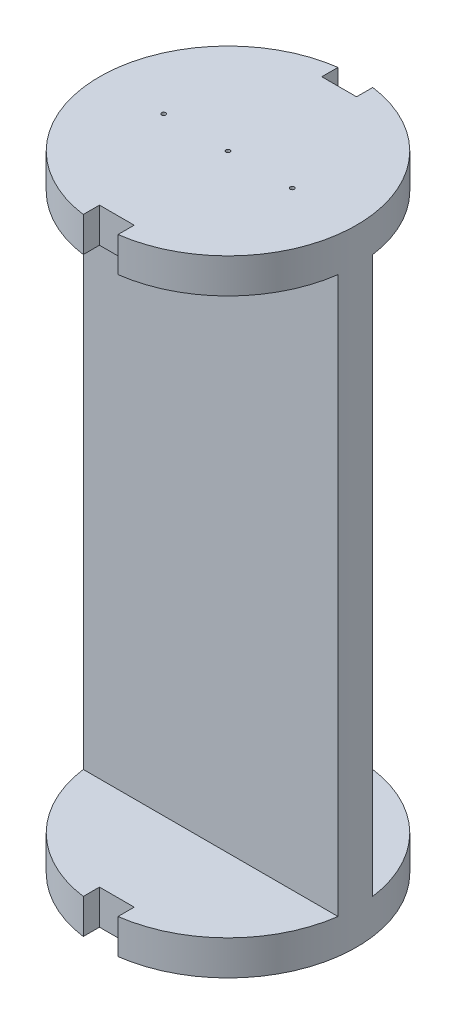
ISO-10303-21;
HEADER;
FILE_DESCRIPTION(('STEP AP214'),'2;1');
FILE_NAME('part.step','',(''),(''),'','','');
FILE_SCHEMA(('AUTOMOTIVE_DESIGN { 1 0 10303 214 1 1 1 1 }'));
ENDSEC;
DATA;
#1=APPLICATION_CONTEXT('core data for automotive mechanical design processes');
#2=APPLICATION_PROTOCOL_DEFINITION('international standard','automotive_design',2000,#1);
#3=PRODUCT_CONTEXT('',#1,'mechanical');
#4=PRODUCT('Part','Part','',(#3));
#5=PRODUCT_RELATED_PRODUCT_CATEGORY('part','',(#4));
#6=PRODUCT_DEFINITION_FORMATION('','',#4);
#7=PRODUCT_DEFINITION_CONTEXT('part definition',#1,'design');
#8=PRODUCT_DEFINITION('design','',#6,#7);
#9=PRODUCT_DEFINITION_SHAPE('','',#8);
#10=(LENGTH_UNIT() NAMED_UNIT(*) SI_UNIT(.MILLI.,.METRE.));
#11=(NAMED_UNIT(*) PLANE_ANGLE_UNIT() SI_UNIT($,.RADIAN.));
#12=(NAMED_UNIT(*) SI_UNIT($,.STERADIAN.) SOLID_ANGLE_UNIT());
#13=UNCERTAINTY_MEASURE_WITH_UNIT(LENGTH_MEASURE(1.E-05),#10,'distance_accuracy_value','');
#14=(GEOMETRIC_REPRESENTATION_CONTEXT(3) GLOBAL_UNCERTAINTY_ASSIGNED_CONTEXT((#13)) GLOBAL_UNIT_ASSIGNED_CONTEXT((#10,
#11,#12)) REPRESENTATION_CONTEXT('',''));
#15=CARTESIAN_POINT('',(0.,0.,0.));
#16=DIRECTION('',(0.,0.,1.));
#17=DIRECTION('',(1.,0.,0.));
#18=AXIS2_PLACEMENT_3D('',#15,#16,#17);
#19=CARTESIAN_POINT('',(0.,10.,0.));
#20=DIRECTION('',(0.,-1.,0.));
#21=DIRECTION('',(0.,0.,-1.));
#22=AXIS2_PLACEMENT_3D('',#19,#20,#21);
#23=CYLINDRICAL_SURFACE('',#22,37.);
#24=CARTESIAN_POINT('',(0.,180.,0.));
#25=DIRECTION('',(0.,1.,0.));
#26=DIRECTION('',(0.,0.,1.));
#27=AXIS2_PLACEMENT_3D('',#24,#25,#26);
#28=CIRCLE('',#27,37.);
#29=CARTESIAN_POINT('',(-5.,180.,-36.6606055596467));
#30=VERTEX_POINT('',#29);
#31=CARTESIAN_POINT('',(-5.,180.,36.6606055596467));
#32=VERTEX_POINT('',#31);
#33=EDGE_CURVE('E316',#30,#32,#28,.T.);
#34=ORIENTED_EDGE('',*,*,#33,.F.);
#35=DIRECTION('',(0.,-1.,0.));
#36=VECTOR('',#35,1.);
#37=CARTESIAN_POINT('',(-5.,10.,-36.6606055596467));
#38=LINE('',#37,#36);
#39=CARTESIAN_POINT('',(-5.,170.,-36.6606055596467));
#40=VERTEX_POINT('',#39);
#41=EDGE_CURVE('E309',#30,#40,#38,.T.);
#42=ORIENTED_EDGE('',*,*,#41,.T.);
#43=CARTESIAN_POINT('',(0.,170.,0.));
#44=DIRECTION('',(0.,1.,0.));
#45=DIRECTION('',(0.,0.,1.));
#46=AXIS2_PLACEMENT_3D('',#43,#44,#45);
#47=CIRCLE('',#46,37.);
#48=CARTESIAN_POINT('',(-36.6606055596467,170.,-5.));
#49=VERTEX_POINT('',#48);
#50=EDGE_CURVE('E321',#40,#49,#47,.T.);
#51=ORIENTED_EDGE('',*,*,#50,.T.);
#52=DIRECTION('',(0.,-1.,0.));
#53=VECTOR('',#52,1.);
#54=CARTESIAN_POINT('',(-36.6606055596467,180.002,-5.));
#55=LINE('',#54,#53);
#56=CARTESIAN_POINT('',(-36.6606055596467,10.,-5.));
#57=VERTEX_POINT('',#56);
#58=EDGE_CURVE('E336',#49,#57,#55,.T.);
#59=ORIENTED_EDGE('',*,*,#58,.T.);
#60=CARTESIAN_POINT('',(0.,10.,0.));
#61=DIRECTION('',(0.,1.,0.));
#62=DIRECTION('',(0.,0.,1.));
#63=AXIS2_PLACEMENT_3D('',#60,#61,#62);
#64=CIRCLE('',#63,37.);
#65=CARTESIAN_POINT('',(-5.,10.,-36.6606055596467));
#66=VERTEX_POINT('',#65);
#67=EDGE_CURVE('E364',#66,#57,#64,.T.);
#68=ORIENTED_EDGE('',*,*,#67,.F.);
#69=CARTESIAN_POINT('',(-5.,0.,-36.6606055596467));
#70=VERTEX_POINT('',#69);
#71=EDGE_CURVE('E313',#66,#70,#38,.T.);
#72=ORIENTED_EDGE('',*,*,#71,.T.);
#73=CARTESIAN_POINT('',(0.,0.,0.));
#74=DIRECTION('',(0.,1.,0.));
#75=DIRECTION('',(0.,0.,1.));
#76=AXIS2_PLACEMENT_3D('',#73,#74,#75);
#77=CIRCLE('',#76,37.);
#78=CARTESIAN_POINT('',(-5.,0.,36.6606055596467));
#79=VERTEX_POINT('',#78);
#80=EDGE_CURVE('E211',#70,#79,#77,.T.);
#81=ORIENTED_EDGE('',*,*,#80,.T.);
#82=DIRECTION('',(0.,-1.,0.));
#83=VECTOR('',#82,1.);
#84=CARTESIAN_POINT('',(-5.,10.,36.6606055596467));
#85=LINE('',#84,#83);
#86=CARTESIAN_POINT('',(-5.,10.,36.6606055596467));
#87=VERTEX_POINT('',#86);
#88=EDGE_CURVE('E271',#79,#87,#85,.F.);
#89=ORIENTED_EDGE('',*,*,#88,.T.);
#90=CARTESIAN_POINT('',(-36.6606055596467,10.,5.));
#91=VERTEX_POINT('',#90);
#92=EDGE_CURVE('E360',#91,#87,#64,.T.);
#93=ORIENTED_EDGE('',*,*,#92,.F.);
#94=DIRECTION('',(0.,-1.,0.));
#95=VECTOR('',#94,1.);
#96=CARTESIAN_POINT('',(-36.6606055596467,180.002,5.));
#97=LINE('',#96,#95);
#98=CARTESIAN_POINT('',(-36.6606055596467,170.,5.));
#99=VERTEX_POINT('',#98);
#100=EDGE_CURVE('E337',#99,#91,#97,.T.);
#101=ORIENTED_EDGE('',*,*,#100,.F.);
#102=CARTESIAN_POINT('',(-5.,170.,36.6606055596467));
#103=VERTEX_POINT('',#102);
#104=EDGE_CURVE('E317',#99,#103,#47,.T.);
#105=ORIENTED_EDGE('',*,*,#104,.T.);
#106=EDGE_CURVE('E266',#103,#32,#85,.F.);
#107=ORIENTED_EDGE('',*,*,#106,.T.);
#108=EDGE_LOOP('',(#34,#42,#51,#59,#68,#72,#81,#89,#93,#101,#105,#107));
#109=FACE_BOUND('',#108,.T.);
#110=ADVANCED_FACE('F48',(#109),#23,.T.);
#111=CARTESIAN_POINT('',(0.,10.,0.));
#112=DIRECTION('',(0.,1.,0.));
#113=DIRECTION('',(0.,0.,1.));
#114=AXIS2_PLACEMENT_3D('',#111,#112,#113);
#115=PLANE('',#114);
#116=DIRECTION('',(0.,0.,1.));
#117=VECTOR('',#116,1.);
#118=CARTESIAN_POINT('',(-5.,10.,0.));
#119=LINE('',#118,#117);
#120=CARTESIAN_POINT('',(-5.,10.,-32.));
#121=VERTEX_POINT('',#120);
#122=EDGE_CURVE('E194',#66,#121,#119,.T.);
#123=ORIENTED_EDGE('',*,*,#122,.F.);
#124=ORIENTED_EDGE('',*,*,#67,.T.);
#125=DIRECTION('',(-1.,0.,0.));
#126=VECTOR('',#125,1.);
#127=CARTESIAN_POINT('',(36.6606055596467,10.,-5.));
#128=LINE('',#127,#126);
#129=CARTESIAN_POINT('',(36.6606055596467,10.,-5.));
#130=VERTEX_POINT('',#129);
#131=EDGE_CURVE('E332',#130,#57,#128,.T.);
#132=ORIENTED_EDGE('',*,*,#131,.F.);
#133=CARTESIAN_POINT('',(5.,10.,-36.6606055596467));
#134=VERTEX_POINT('',#133);
#135=EDGE_CURVE('E366',#130,#134,#64,.T.);
#136=ORIENTED_EDGE('',*,*,#135,.T.);
#137=DIRECTION('',(0.,0.,-1.));
#138=VECTOR('',#137,1.);
#139=CARTESIAN_POINT('',(5.,10.,0.));
#140=LINE('',#139,#138);
#141=CARTESIAN_POINT('',(5.,10.,-32.));
#142=VERTEX_POINT('',#141);
#143=EDGE_CURVE('E302',#142,#134,#140,.T.);
#144=ORIENTED_EDGE('',*,*,#143,.F.);
#145=DIRECTION('',(1.,0.,0.));
#146=VECTOR('',#145,1.);
#147=CARTESIAN_POINT('',(0.,10.,-32.));
#148=LINE('',#147,#146);
#149=EDGE_CURVE('E290',#121,#142,#148,.T.);
#150=ORIENTED_EDGE('',*,*,#149,.F.);
#151=EDGE_LOOP('',(#123,#124,#132,#136,#144,#150));
#152=FACE_BOUND('',#151,.T.);
#153=ADVANCED_FACE('F483',(#152),#115,.T.);
#154=CARTESIAN_POINT('',(5.,0.,36.6606055596467));
#155=VERTEX_POINT('',#154);
#156=CARTESIAN_POINT('',(5.,0.,-36.6606055596467));
#157=VERTEX_POINT('',#156);
#158=EDGE_CURVE('E367',#155,#157,#77,.T.);
#159=ORIENTED_EDGE('',*,*,#158,.T.);
#160=DIRECTION('',(0.,-1.,0.));
#161=VECTOR('',#160,1.);
#162=CARTESIAN_POINT('',(5.,10.,-36.6606055596467));
#163=LINE('',#162,#161);
#164=EDGE_CURVE('E301',#157,#134,#163,.F.);
#165=ORIENTED_EDGE('',*,*,#164,.T.);
#166=ORIENTED_EDGE('',*,*,#135,.F.);
#167=DIRECTION('',(0.,-1.,0.));
#168=VECTOR('',#167,1.);
#169=CARTESIAN_POINT('',(36.6606055596467,180.002,-5.));
#170=LINE('',#169,#168);
#171=CARTESIAN_POINT('',(36.6606055596467,170.,-5.));
#172=VERTEX_POINT('',#171);
#173=EDGE_CURVE('E346',#172,#130,#170,.T.);
#174=ORIENTED_EDGE('',*,*,#173,.F.);
#175=CARTESIAN_POINT('',(5.,170.,-36.6606055596467));
#176=VERTEX_POINT('',#175);
#177=EDGE_CURVE('E323',#172,#176,#47,.T.);
#178=ORIENTED_EDGE('',*,*,#177,.T.);
#179=CARTESIAN_POINT('',(5.,180.,-36.6606055596467));
#180=VERTEX_POINT('',#179);
#181=EDGE_CURVE('E297',#176,#180,#163,.F.);
#182=ORIENTED_EDGE('',*,*,#181,.T.);
#183=CARTESIAN_POINT('',(5.,180.,36.6606055596467));
#184=VERTEX_POINT('',#183);
#185=EDGE_CURVE('E324',#184,#180,#28,.T.);
#186=ORIENTED_EDGE('',*,*,#185,.F.);
#187=DIRECTION('',(0.,-1.,0.));
#188=VECTOR('',#187,1.);
#189=CARTESIAN_POINT('',(5.,10.,36.6606055596467));
#190=LINE('',#189,#188);
#191=CARTESIAN_POINT('',(5.,170.,36.6606055596467));
#192=VERTEX_POINT('',#191);
#193=EDGE_CURVE('E278',#184,#192,#190,.T.);
#194=ORIENTED_EDGE('',*,*,#193,.T.);
#195=CARTESIAN_POINT('',(36.6606055596467,170.,5.));
#196=VERTEX_POINT('',#195);
#197=EDGE_CURVE('E322',#192,#196,#47,.T.);
#198=ORIENTED_EDGE('',*,*,#197,.T.);
#199=DIRECTION('',(0.,-1.,0.));
#200=VECTOR('',#199,1.);
#201=CARTESIAN_POINT('',(36.6606055596467,180.002,5.));
#202=LINE('',#201,#200);
#203=CARTESIAN_POINT('',(36.6606055596467,10.,5.));
#204=VERTEX_POINT('',#203);
#205=EDGE_CURVE('E341',#196,#204,#202,.T.);
#206=ORIENTED_EDGE('',*,*,#205,.T.);
#207=CARTESIAN_POINT('',(5.,10.,36.6606055596467));
#208=VERTEX_POINT('',#207);
#209=EDGE_CURVE('E365',#208,#204,#64,.T.);
#210=ORIENTED_EDGE('',*,*,#209,.F.);
#211=EDGE_CURVE('E283',#208,#155,#190,.T.);
#212=ORIENTED_EDGE('',*,*,#211,.T.);
#213=EDGE_LOOP('',(#159,#165,#166,#174,#178,#182,#186,#194,#198,#206,#210,#212));
#214=FACE_BOUND('',#213,.T.);
#215=ADVANCED_FACE('F50',(#214),#23,.T.);
#216=DIRECTION('',(0.,0.,-1.));
#217=VECTOR('',#216,1.);
#218=CARTESIAN_POINT('',(5.,10.,0.));
#219=LINE('',#218,#217);
#220=CARTESIAN_POINT('',(5.,10.,32.));
#221=VERTEX_POINT('',#220);
#222=EDGE_CURVE('E282',#208,#221,#219,.T.);
#223=ORIENTED_EDGE('',*,*,#222,.F.);
#224=ORIENTED_EDGE('',*,*,#209,.T.);
#225=DIRECTION('',(1.,0.,0.));
#226=VECTOR('',#225,1.);
#227=CARTESIAN_POINT('',(36.6606055596467,10.,5.));
#228=LINE('',#227,#226);
#229=EDGE_CURVE('E328',#91,#204,#228,.T.);
#230=ORIENTED_EDGE('',*,*,#229,.F.);
#231=ORIENTED_EDGE('',*,*,#92,.T.);
#232=DIRECTION('',(0.,0.,1.));
#233=VECTOR('',#232,1.);
#234=CARTESIAN_POINT('',(-5.,10.,0.));
#235=LINE('',#234,#233);
#236=CARTESIAN_POINT('',(-5.,10.,32.));
#237=VERTEX_POINT('',#236);
#238=EDGE_CURVE('E270',#237,#87,#235,.T.);
#239=ORIENTED_EDGE('',*,*,#238,.F.);
#240=DIRECTION('',(-1.,0.,0.));
#241=VECTOR('',#240,1.);
#242=CARTESIAN_POINT('',(0.,10.,32.));
#243=LINE('',#242,#241);
#244=EDGE_CURVE('E259',#221,#237,#243,.T.);
#245=ORIENTED_EDGE('',*,*,#244,.F.);
#246=EDGE_LOOP('',(#223,#224,#230,#231,#239,#245));
#247=FACE_BOUND('',#246,.T.);
#248=ADVANCED_FACE('F386',(#247),#115,.T.);
#249=CARTESIAN_POINT('',(0.,0.,0.));
#250=DIRECTION('',(0.,1.,0.));
#251=DIRECTION('',(0.,0.,1.));
#252=AXIS2_PLACEMENT_3D('',#249,#250,#251);
#253=PLANE('',#252);
#254=CARTESIAN_POINT('',(-19.25,0.,0.));
#255=DIRECTION('',(0.,-1.,0.));
#256=DIRECTION('',(0.,0.,-1.));
#257=AXIS2_PLACEMENT_3D('',#254,#255,#256);
#258=CIRCLE('',#257,0.6);
#259=CARTESIAN_POINT('',(-19.25,0.,-0.599999999999998));
#260=VERTEX_POINT('',#259);
#261=EDGE_CURVE('E442',#260,#260,#258,.T.);
#262=ORIENTED_EDGE('',*,*,#261,.F.);
#263=EDGE_LOOP('',(#262));
#264=FACE_BOUND('',#263,.T.);
#265=CARTESIAN_POINT('',(0.,0.,0.));
#266=DIRECTION('',(0.,-1.,0.));
#267=DIRECTION('',(0.,0.,-1.));
#268=AXIS2_PLACEMENT_3D('',#265,#266,#267);
#269=CIRCLE('',#268,0.6);
#270=CARTESIAN_POINT('',(0.,0.,-0.6));
#271=VERTEX_POINT('',#270);
#272=EDGE_CURVE('E448',#271,#271,#269,.T.);
#273=ORIENTED_EDGE('',*,*,#272,.F.);
#274=EDGE_LOOP('',(#273));
#275=FACE_BOUND('',#274,.T.);
#276=CARTESIAN_POINT('',(19.25,0.,0.));
#277=DIRECTION('',(0.,-1.,0.));
#278=DIRECTION('',(0.,0.,-1.));
#279=AXIS2_PLACEMENT_3D('',#276,#277,#278);
#280=CIRCLE('',#279,0.6);
#281=CARTESIAN_POINT('',(19.25,0.,-0.6));
#282=VERTEX_POINT('',#281);
#283=EDGE_CURVE('E457',#282,#282,#280,.T.);
#284=ORIENTED_EDGE('',*,*,#283,.F.);
#285=EDGE_LOOP('',(#284));
#286=FACE_BOUND('',#285,.T.);
#287=ORIENTED_EDGE('',*,*,#80,.F.);
#288=DIRECTION('',(0.,0.,1.));
#289=VECTOR('',#288,1.);
#290=CARTESIAN_POINT('',(-5.,0.,-42.));
#291=LINE('',#290,#289);
#292=CARTESIAN_POINT('',(-5.,0.,-32.));
#293=VERTEX_POINT('',#292);
#294=EDGE_CURVE('E191',#70,#293,#291,.T.);
#295=ORIENTED_EDGE('',*,*,#294,.T.);
#296=DIRECTION('',(1.,0.,0.));
#297=VECTOR('',#296,1.);
#298=CARTESIAN_POINT('',(5.,0.,-32.));
#299=LINE('',#298,#297);
#300=CARTESIAN_POINT('',(5.,0.,-32.));
#301=VERTEX_POINT('',#300);
#302=EDGE_CURVE('E202',#293,#301,#299,.T.);
#303=ORIENTED_EDGE('',*,*,#302,.T.);
#304=DIRECTION('',(0.,0.,-1.));
#305=VECTOR('',#304,1.);
#306=CARTESIAN_POINT('',(5.,0.,-42.));
#307=LINE('',#306,#305);
#308=EDGE_CURVE('E64',#301,#157,#307,.T.);
#309=ORIENTED_EDGE('',*,*,#308,.T.);
#310=ORIENTED_EDGE('',*,*,#158,.F.);
#311=DIRECTION('',(0.,0.,-1.));
#312=VECTOR('',#311,1.);
#313=CARTESIAN_POINT('',(5.,0.,42.));
#314=LINE('',#313,#312);
#315=CARTESIAN_POINT('',(5.,0.,32.));
#316=VERTEX_POINT('',#315);
#317=EDGE_CURVE('E243',#155,#316,#314,.T.);
#318=ORIENTED_EDGE('',*,*,#317,.T.);
#319=DIRECTION('',(-1.,0.,0.));
#320=VECTOR('',#319,1.);
#321=CARTESIAN_POINT('',(5.,0.,32.));
#322=LINE('',#321,#320);
#323=CARTESIAN_POINT('',(-5.,0.,32.));
#324=VERTEX_POINT('',#323);
#325=EDGE_CURVE('E249',#316,#324,#322,.T.);
#326=ORIENTED_EDGE('',*,*,#325,.T.);
#327=DIRECTION('',(0.,0.,1.));
#328=VECTOR('',#327,1.);
#329=CARTESIAN_POINT('',(-5.,0.,42.));
#330=LINE('',#329,#328);
#331=EDGE_CURVE('E72',#324,#79,#330,.T.);
#332=ORIENTED_EDGE('',*,*,#331,.T.);
#333=EDGE_LOOP('',(#287,#295,#303,#309,#310,#318,#326,#332));
#334=FACE_BOUND('',#333,.T.);
#335=ADVANCED_FACE('F209',(#264,#275,#286,#334),#253,.F.);
#336=CARTESIAN_POINT('',(36.6606055596467,180.002,5.));
#337=DIRECTION('',(0.,0.,-1.));
#338=DIRECTION('',(-1.,0.,0.));
#339=AXIS2_PLACEMENT_3D('',#336,#337,#338);
#340=PLANE('',#339);
#341=DIRECTION('',(1.,0.,0.));
#342=VECTOR('',#341,1.);
#343=CARTESIAN_POINT('',(36.6606055596467,170.,5.));
#344=LINE('',#343,#342);
#345=EDGE_CURVE('E342',#99,#196,#344,.T.);
#346=ORIENTED_EDGE('',*,*,#345,.F.);
#347=ORIENTED_EDGE('',*,*,#100,.T.);
#348=ORIENTED_EDGE('',*,*,#229,.T.);
#349=ORIENTED_EDGE('',*,*,#205,.F.);
#350=EDGE_LOOP('',(#346,#347,#348,#349));
#351=FACE_BOUND('',#350,.T.);
#352=ADVANCED_FACE('F394',(#351),#340,.F.);
#353=CARTESIAN_POINT('',(36.6606055596467,180.002,-5.));
#354=DIRECTION('',(0.,0.,1.));
#355=DIRECTION('',(1.,0.,0.));
#356=AXIS2_PLACEMENT_3D('',#353,#354,#355);
#357=PLANE('',#356);
#358=DIRECTION('',(-1.,0.,0.));
#359=VECTOR('',#358,1.);
#360=CARTESIAN_POINT('',(36.6606055596467,170.,-5.));
#361=LINE('',#360,#359);
#362=EDGE_CURVE('E356',#172,#49,#361,.T.);
#363=ORIENTED_EDGE('',*,*,#362,.F.);
#364=ORIENTED_EDGE('',*,*,#173,.T.);
#365=ORIENTED_EDGE('',*,*,#131,.T.);
#366=ORIENTED_EDGE('',*,*,#58,.F.);
#367=EDGE_LOOP('',(#363,#364,#365,#366));
#368=FACE_BOUND('',#367,.T.);
#369=ADVANCED_FACE('F497',(#368),#357,.F.);
#370=CARTESIAN_POINT('',(0.,170.,0.));
#371=DIRECTION('',(0.,1.,0.));
#372=DIRECTION('',(0.,0.,1.));
#373=AXIS2_PLACEMENT_3D('',#370,#371,#372);
#374=PLANE('',#373);
#375=ORIENTED_EDGE('',*,*,#197,.F.);
#376=DIRECTION('',(0.,0.,-1.));
#377=VECTOR('',#376,1.);
#378=CARTESIAN_POINT('',(5.,170.,0.));
#379=LINE('',#378,#377);
#380=CARTESIAN_POINT('',(5.,170.,32.));
#381=VERTEX_POINT('',#380);
#382=EDGE_CURVE('E274',#192,#381,#379,.T.);
#383=ORIENTED_EDGE('',*,*,#382,.T.);
#384=DIRECTION('',(-1.,0.,0.));
#385=VECTOR('',#384,1.);
#386=CARTESIAN_POINT('',(0.,170.,32.));
#387=LINE('',#386,#385);
#388=CARTESIAN_POINT('',(-5.,170.,32.));
#389=VERTEX_POINT('',#388);
#390=EDGE_CURVE('E229',#381,#389,#387,.T.);
#391=ORIENTED_EDGE('',*,*,#390,.T.);
#392=DIRECTION('',(0.,0.,1.));
#393=VECTOR('',#392,1.);
#394=CARTESIAN_POINT('',(-5.,170.,0.));
#395=LINE('',#394,#393);
#396=EDGE_CURVE('E262',#389,#103,#395,.T.);
#397=ORIENTED_EDGE('',*,*,#396,.T.);
#398=ORIENTED_EDGE('',*,*,#104,.F.);
#399=ORIENTED_EDGE('',*,*,#345,.T.);
#400=EDGE_LOOP('',(#375,#383,#391,#397,#398,#399));
#401=FACE_BOUND('',#400,.T.);
#402=ADVANCED_FACE('F401',(#401),#374,.F.);
#403=ORIENTED_EDGE('',*,*,#50,.F.);
#404=DIRECTION('',(0.,0.,1.));
#405=VECTOR('',#404,1.);
#406=CARTESIAN_POINT('',(-5.,170.,0.));
#407=LINE('',#406,#405);
#408=CARTESIAN_POINT('',(-5.,170.,-32.));
#409=VERTEX_POINT('',#408);
#410=EDGE_CURVE('E305',#40,#409,#407,.T.);
#411=ORIENTED_EDGE('',*,*,#410,.T.);
#412=DIRECTION('',(1.,0.,0.));
#413=VECTOR('',#412,1.);
#414=CARTESIAN_POINT('',(0.,170.,-32.));
#415=LINE('',#414,#413);
#416=CARTESIAN_POINT('',(5.,170.,-32.));
#417=VERTEX_POINT('',#416);
#418=EDGE_CURVE('E286',#409,#417,#415,.T.);
#419=ORIENTED_EDGE('',*,*,#418,.T.);
#420=DIRECTION('',(0.,0.,-1.));
#421=VECTOR('',#420,1.);
#422=CARTESIAN_POINT('',(5.,170.,0.));
#423=LINE('',#422,#421);
#424=EDGE_CURVE('E293',#417,#176,#423,.T.);
#425=ORIENTED_EDGE('',*,*,#424,.T.);
#426=ORIENTED_EDGE('',*,*,#177,.F.);
#427=ORIENTED_EDGE('',*,*,#362,.T.);
#428=EDGE_LOOP('',(#403,#411,#419,#425,#426,#427));
#429=FACE_BOUND('',#428,.T.);
#430=ADVANCED_FACE('F506',(#429),#374,.F.);
#431=CARTESIAN_POINT('',(0.,180.,0.));
#432=DIRECTION('',(0.,1.,0.));
#433=DIRECTION('',(0.,0.,1.));
#434=AXIS2_PLACEMENT_3D('',#431,#432,#433);
#435=PLANE('',#434);
#436=CARTESIAN_POINT('',(-18.5,180.,0.));
#437=DIRECTION('',(0.,1.,0.));
#438=DIRECTION('',(0.,0.,1.));
#439=AXIS2_PLACEMENT_3D('',#436,#437,#438);
#440=CIRCLE('',#439,0.6);
#441=CARTESIAN_POINT('',(-18.5,180.,0.600000000000002));
#442=VERTEX_POINT('',#441);
#443=EDGE_CURVE('E412',#442,#442,#440,.T.);
#444=ORIENTED_EDGE('',*,*,#443,.F.);
#445=EDGE_LOOP('',(#444));
#446=FACE_BOUND('',#445,.T.);
#447=CARTESIAN_POINT('',(0.,180.,0.));
#448=DIRECTION('',(0.,1.,0.));
#449=DIRECTION('',(0.,0.,1.));
#450=AXIS2_PLACEMENT_3D('',#447,#448,#449);
#451=CIRCLE('',#450,0.6);
#452=CARTESIAN_POINT('',(0.,180.,0.6));
#453=VERTEX_POINT('',#452);
#454=EDGE_CURVE('E427',#453,#453,#451,.T.);
#455=ORIENTED_EDGE('',*,*,#454,.F.);
#456=EDGE_LOOP('',(#455));
#457=FACE_BOUND('',#456,.T.);
#458=CARTESIAN_POINT('',(18.5,180.,0.));
#459=DIRECTION('',(0.,1.,0.));
#460=DIRECTION('',(0.,0.,1.));
#461=AXIS2_PLACEMENT_3D('',#458,#459,#460);
#462=CIRCLE('',#461,0.6);
#463=CARTESIAN_POINT('',(18.5,180.,0.6));
#464=VERTEX_POINT('',#463);
#465=EDGE_CURVE('E219',#464,#464,#462,.T.);
#466=ORIENTED_EDGE('',*,*,#465,.F.);
#467=EDGE_LOOP('',(#466));
#468=FACE_BOUND('',#467,.T.);
#469=DIRECTION('',(0.,0.,1.));
#470=VECTOR('',#469,1.);
#471=CARTESIAN_POINT('',(-5.,180.,0.));
#472=LINE('',#471,#470);
#473=CARTESIAN_POINT('',(-5.,180.,-32.));
#474=VERTEX_POINT('',#473);
#475=EDGE_CURVE('E12',#30,#474,#472,.T.);
#476=ORIENTED_EDGE('',*,*,#475,.F.);
#477=ORIENTED_EDGE('',*,*,#33,.T.);
#478=DIRECTION('',(0.,0.,1.));
#479=VECTOR('',#478,1.);
#480=CARTESIAN_POINT('',(-5.,180.,42.));
#481=LINE('',#480,#479);
#482=CARTESIAN_POINT('',(-5.,180.,32.));
#483=VERTEX_POINT('',#482);
#484=EDGE_CURVE('E240',#483,#32,#481,.T.);
#485=ORIENTED_EDGE('',*,*,#484,.F.);
#486=DIRECTION('',(-1.,0.,0.));
#487=VECTOR('',#486,1.);
#488=CARTESIAN_POINT('',(5.,180.,32.));
#489=LINE('',#488,#487);
#490=CARTESIAN_POINT('',(5.,180.,32.));
#491=VERTEX_POINT('',#490);
#492=EDGE_CURVE('E226',#491,#483,#489,.T.);
#493=ORIENTED_EDGE('',*,*,#492,.F.);
#494=DIRECTION('',(0.,0.,-1.));
#495=VECTOR('',#494,1.);
#496=CARTESIAN_POINT('',(5.,180.,0.));
#497=LINE('',#496,#495);
#498=EDGE_CURVE('E57',#184,#491,#497,.T.);
#499=ORIENTED_EDGE('',*,*,#498,.F.);
#500=ORIENTED_EDGE('',*,*,#185,.T.);
#501=DIRECTION('',(0.,0.,-1.));
#502=VECTOR('',#501,1.);
#503=CARTESIAN_POINT('',(5.,180.,-42.));
#504=LINE('',#503,#502);
#505=CARTESIAN_POINT('',(5.,180.,-32.));
#506=VERTEX_POINT('',#505);
#507=EDGE_CURVE('E213',#506,#180,#504,.T.);
#508=ORIENTED_EDGE('',*,*,#507,.F.);
#509=DIRECTION('',(1.,0.,0.));
#510=VECTOR('',#509,1.);
#511=CARTESIAN_POINT('',(5.,180.,-32.));
#512=LINE('',#511,#510);
#513=EDGE_CURVE('E216',#474,#506,#512,.T.);
#514=ORIENTED_EDGE('',*,*,#513,.F.);
#515=EDGE_LOOP('',(#476,#477,#485,#493,#499,#500,#508,#514));
#516=FACE_BOUND('',#515,.T.);
#517=ADVANCED_FACE('F503',(#446,#457,#468,#516),#435,.T.);
#518=CARTESIAN_POINT('',(5.,0.,32.));
#519=DIRECTION('',(0.,0.,-1.));
#520=DIRECTION('',(-1.,0.,0.));
#521=AXIS2_PLACEMENT_3D('',#518,#519,#520);
#522=PLANE('',#521);
#523=DIRECTION('',(0.,1.,0.));
#524=VECTOR('',#523,1.);
#525=CARTESIAN_POINT('',(5.,0.,32.));
#526=LINE('',#525,#524);
#527=EDGE_CURVE('E235',#381,#491,#526,.T.);
#528=ORIENTED_EDGE('',*,*,#527,.T.);
#529=ORIENTED_EDGE('',*,*,#492,.T.);
#530=DIRECTION('',(0.,1.,0.));
#531=VECTOR('',#530,1.);
#532=CARTESIAN_POINT('',(-5.,0.,32.));
#533=LINE('',#532,#531);
#534=EDGE_CURVE('E239',#389,#483,#533,.T.);
#535=ORIENTED_EDGE('',*,*,#534,.F.);
#536=ORIENTED_EDGE('',*,*,#390,.F.);
#537=EDGE_LOOP('',(#528,#529,#535,#536));
#538=FACE_BOUND('',#537,.T.);
#539=ADVANCED_FACE('F406',(#538),#522,.F.);
#540=CARTESIAN_POINT('',(-5.,0.,42.));
#541=DIRECTION('',(-1.,0.,0.));
#542=DIRECTION('',(0.,0.,1.));
#543=AXIS2_PLACEMENT_3D('',#540,#541,#542);
#544=PLANE('',#543);
#545=ORIENTED_EDGE('',*,*,#396,.F.);
#546=ORIENTED_EDGE('',*,*,#534,.T.);
#547=ORIENTED_EDGE('',*,*,#484,.T.);
#548=ORIENTED_EDGE('',*,*,#106,.F.);
#549=EDGE_LOOP('',(#545,#546,#547,#548));
#550=FACE_BOUND('',#549,.T.);
#551=ADVANCED_FACE('F404',(#550),#544,.F.);
#552=CARTESIAN_POINT('',(5.,0.,42.));
#553=DIRECTION('',(1.,0.,0.));
#554=DIRECTION('',(0.,0.,-1.));
#555=AXIS2_PLACEMENT_3D('',#552,#553,#554);
#556=PLANE('',#555);
#557=ORIENTED_EDGE('',*,*,#498,.T.);
#558=ORIENTED_EDGE('',*,*,#527,.F.);
#559=ORIENTED_EDGE('',*,*,#382,.F.);
#560=ORIENTED_EDGE('',*,*,#193,.F.);
#561=EDGE_LOOP('',(#557,#558,#559,#560));
#562=FACE_BOUND('',#561,.T.);
#563=ADVANCED_FACE('F521',(#562),#556,.F.);
#564=CARTESIAN_POINT('',(5.,0.,-32.));
#565=DIRECTION('',(0.,0.,1.));
#566=DIRECTION('',(1.,0.,0.));
#567=AXIS2_PLACEMENT_3D('',#564,#565,#566);
#568=PLANE('',#567);
#569=DIRECTION('',(0.,1.,0.));
#570=VECTOR('',#569,1.);
#571=CARTESIAN_POINT('',(-5.,0.,-32.));
#572=LINE('',#571,#570);
#573=EDGE_CURVE('E199',#409,#474,#572,.T.);
#574=ORIENTED_EDGE('',*,*,#573,.T.);
#575=ORIENTED_EDGE('',*,*,#513,.T.);
#576=DIRECTION('',(0.,1.,0.));
#577=VECTOR('',#576,1.);
#578=CARTESIAN_POINT('',(5.,0.,-32.));
#579=LINE('',#578,#577);
#580=EDGE_CURVE('E198',#417,#506,#579,.T.);
#581=ORIENTED_EDGE('',*,*,#580,.F.);
#582=ORIENTED_EDGE('',*,*,#418,.F.);
#583=EDGE_LOOP('',(#574,#575,#581,#582));
#584=FACE_BOUND('',#583,.T.);
#585=ADVANCED_FACE('F528',(#584),#568,.F.);
#586=CARTESIAN_POINT('',(5.,0.,-42.));
#587=DIRECTION('',(1.,0.,0.));
#588=DIRECTION('',(0.,0.,-1.));
#589=AXIS2_PLACEMENT_3D('',#586,#587,#588);
#590=PLANE('',#589);
#591=ORIENTED_EDGE('',*,*,#424,.F.);
#592=ORIENTED_EDGE('',*,*,#580,.T.);
#593=ORIENTED_EDGE('',*,*,#507,.T.);
#594=ORIENTED_EDGE('',*,*,#181,.F.);
#595=EDGE_LOOP('',(#591,#592,#593,#594));
#596=FACE_BOUND('',#595,.T.);
#597=ADVANCED_FACE('F531',(#596),#590,.F.);
#598=CARTESIAN_POINT('',(-5.,0.,-42.));
#599=DIRECTION('',(-1.,0.,0.));
#600=DIRECTION('',(0.,0.,1.));
#601=AXIS2_PLACEMENT_3D('',#598,#599,#600);
#602=PLANE('',#601);
#603=ORIENTED_EDGE('',*,*,#475,.T.);
#604=ORIENTED_EDGE('',*,*,#573,.F.);
#605=ORIENTED_EDGE('',*,*,#410,.F.);
#606=ORIENTED_EDGE('',*,*,#41,.F.);
#607=EDGE_LOOP('',(#603,#604,#605,#606));
#608=FACE_BOUND('',#607,.T.);
#609=ADVANCED_FACE('F519',(#608),#602,.F.);
#610=ORIENTED_EDGE('',*,*,#222,.T.);
#611=EDGE_CURVE('E231',#316,#221,#526,.T.);
#612=ORIENTED_EDGE('',*,*,#611,.F.);
#613=ORIENTED_EDGE('',*,*,#317,.F.);
#614=ORIENTED_EDGE('',*,*,#211,.F.);
#615=EDGE_LOOP('',(#610,#612,#613,#614));
#616=FACE_BOUND('',#615,.T.);
#617=ADVANCED_FACE('F513',(#616),#556,.F.);
#618=ORIENTED_EDGE('',*,*,#331,.F.);
#619=EDGE_CURVE('E236',#324,#237,#533,.T.);
#620=ORIENTED_EDGE('',*,*,#619,.T.);
#621=ORIENTED_EDGE('',*,*,#238,.T.);
#622=ORIENTED_EDGE('',*,*,#88,.F.);
#623=EDGE_LOOP('',(#618,#620,#621,#622));
#624=FACE_BOUND('',#623,.T.);
#625=ADVANCED_FACE('F509',(#624),#544,.F.);
#626=ORIENTED_EDGE('',*,*,#244,.T.);
#627=ORIENTED_EDGE('',*,*,#619,.F.);
#628=ORIENTED_EDGE('',*,*,#325,.F.);
#629=ORIENTED_EDGE('',*,*,#611,.T.);
#630=EDGE_LOOP('',(#626,#627,#628,#629));
#631=FACE_BOUND('',#630,.T.);
#632=ADVANCED_FACE('F512',(#631),#522,.F.);
#633=ORIENTED_EDGE('',*,*,#122,.T.);
#634=EDGE_CURVE('E187',#293,#121,#572,.T.);
#635=ORIENTED_EDGE('',*,*,#634,.F.);
#636=ORIENTED_EDGE('',*,*,#294,.F.);
#637=ORIENTED_EDGE('',*,*,#71,.F.);
#638=EDGE_LOOP('',(#633,#635,#636,#637));
#639=FACE_BOUND('',#638,.T.);
#640=ADVANCED_FACE('F189',(#639),#602,.F.);
#641=ORIENTED_EDGE('',*,*,#143,.T.);
#642=ORIENTED_EDGE('',*,*,#164,.F.);
#643=ORIENTED_EDGE('',*,*,#308,.F.);
#644=EDGE_CURVE('E204',#301,#142,#579,.T.);
#645=ORIENTED_EDGE('',*,*,#644,.T.);
#646=EDGE_LOOP('',(#641,#642,#643,#645));
#647=FACE_BOUND('',#646,.T.);
#648=ADVANCED_FACE('F524',(#647),#590,.F.);
#649=ORIENTED_EDGE('',*,*,#149,.T.);
#650=ORIENTED_EDGE('',*,*,#644,.F.);
#651=ORIENTED_EDGE('',*,*,#302,.F.);
#652=ORIENTED_EDGE('',*,*,#634,.T.);
#653=EDGE_LOOP('',(#649,#650,#651,#652));
#654=FACE_BOUND('',#653,.T.);
#655=ADVANCED_FACE('F203',(#654),#568,.F.);
#656=CARTESIAN_POINT('',(18.5,160.25,0.));
#657=DIRECTION('',(0.,1.,0.));
#658=DIRECTION('',(0.,0.,1.));
#659=AXIS2_PLACEMENT_3D('',#656,#657,#658);
#660=CYLINDRICAL_SURFACE('',#659,0.6);
#661=CARTESIAN_POINT('',(18.5,160.25,0.));
#662=DIRECTION('',(0.,1.,0.));
#663=DIRECTION('',(0.,0.,1.));
#664=AXIS2_PLACEMENT_3D('',#661,#662,#663);
#665=CIRCLE('',#664,0.6);
#666=CARTESIAN_POINT('',(18.5,160.25,0.6));
#667=VERTEX_POINT('',#666);
#668=EDGE_CURVE('E430',#667,#667,#665,.T.);
#669=ORIENTED_EDGE('',*,*,#668,.F.);
#670=EDGE_LOOP('',(#669));
#671=FACE_BOUND('',#670,.T.);
#672=ORIENTED_EDGE('',*,*,#465,.T.);
#673=EDGE_LOOP('',(#672));
#674=FACE_BOUND('',#673,.T.);
#675=ADVANCED_FACE('F527',(#671,#674),#660,.F.);
#676=CARTESIAN_POINT('',(0.,160.25,0.));
#677=DIRECTION('',(0.,1.,0.));
#678=DIRECTION('',(0.,0.,1.));
#679=AXIS2_PLACEMENT_3D('',#676,#677,#678);
#680=PLANE('',#679);
#681=ORIENTED_EDGE('',*,*,#668,.T.);
#682=EDGE_LOOP('',(#681));
#683=FACE_BOUND('',#682,.T.);
#684=ADVANCED_FACE('F534',(#683),#680,.T.);
#685=CARTESIAN_POINT('',(0.,160.25,0.));
#686=DIRECTION('',(0.,1.,0.));
#687=DIRECTION('',(0.,0.,1.));
#688=AXIS2_PLACEMENT_3D('',#685,#686,#687);
#689=CYLINDRICAL_SURFACE('',#688,0.6);
#690=CARTESIAN_POINT('',(0.,160.25,0.));
#691=DIRECTION('',(0.,1.,0.));
#692=DIRECTION('',(0.,0.,1.));
#693=AXIS2_PLACEMENT_3D('',#690,#691,#692);
#694=CIRCLE('',#693,0.6);
#695=CARTESIAN_POINT('',(0.,160.25,0.6));
#696=VERTEX_POINT('',#695);
#697=EDGE_CURVE('E418',#696,#696,#694,.T.);
#698=ORIENTED_EDGE('',*,*,#697,.F.);
#699=EDGE_LOOP('',(#698));
#700=FACE_BOUND('',#699,.T.);
#701=ORIENTED_EDGE('',*,*,#454,.T.);
#702=EDGE_LOOP('',(#701));
#703=FACE_BOUND('',#702,.T.);
#704=ADVANCED_FACE('F538',(#700,#703),#689,.F.);
#705=CARTESIAN_POINT('',(0.,160.25,0.));
#706=DIRECTION('',(0.,1.,0.));
#707=DIRECTION('',(0.,0.,1.));
#708=AXIS2_PLACEMENT_3D('',#705,#706,#707);
#709=PLANE('',#708);
#710=ORIENTED_EDGE('',*,*,#697,.T.);
#711=EDGE_LOOP('',(#710));
#712=FACE_BOUND('',#711,.T.);
#713=ADVANCED_FACE('F541',(#712),#709,.T.);
#714=CARTESIAN_POINT('',(-18.5,160.25,0.));
#715=DIRECTION('',(0.,1.,0.));
#716=DIRECTION('',(0.,0.,1.));
#717=AXIS2_PLACEMENT_3D('',#714,#715,#716);
#718=CYLINDRICAL_SURFACE('',#717,0.6);
#719=CARTESIAN_POINT('',(-18.5,160.25,0.));
#720=DIRECTION('',(0.,1.,0.));
#721=DIRECTION('',(0.,0.,1.));
#722=AXIS2_PLACEMENT_3D('',#719,#720,#721);
#723=CIRCLE('',#722,0.6);
#724=CARTESIAN_POINT('',(-18.5,160.25,0.600000000000002));
#725=VERTEX_POINT('',#724);
#726=EDGE_CURVE('E409',#725,#725,#723,.T.);
#727=ORIENTED_EDGE('',*,*,#726,.F.);
#728=EDGE_LOOP('',(#727));
#729=FACE_BOUND('',#728,.T.);
#730=ORIENTED_EDGE('',*,*,#443,.T.);
#731=EDGE_LOOP('',(#730));
#732=FACE_BOUND('',#731,.T.);
#733=ADVANCED_FACE('F479',(#729,#732),#718,.F.);
#734=CARTESIAN_POINT('',(0.,160.25,0.));
#735=DIRECTION('',(0.,1.,0.));
#736=DIRECTION('',(0.,0.,1.));
#737=AXIS2_PLACEMENT_3D('',#734,#735,#736);
#738=PLANE('',#737);
#739=ORIENTED_EDGE('',*,*,#726,.T.);
#740=EDGE_LOOP('',(#739));
#741=FACE_BOUND('',#740,.T.);
#742=ADVANCED_FACE('F470',(#741),#738,.T.);
#743=CARTESIAN_POINT('',(19.25,19.75,0.));
#744=DIRECTION('',(0.,-1.,0.));
#745=DIRECTION('',(0.,0.,-1.));
#746=AXIS2_PLACEMENT_3D('',#743,#744,#745);
#747=CYLINDRICAL_SURFACE('',#746,0.6);
#748=CARTESIAN_POINT('',(19.25,19.75,0.));
#749=DIRECTION('',(0.,-1.,0.));
#750=DIRECTION('',(0.,0.,-1.));
#751=AXIS2_PLACEMENT_3D('',#748,#749,#750);
#752=CIRCLE('',#751,0.6);
#753=CARTESIAN_POINT('',(19.25,19.75,-0.6));
#754=VERTEX_POINT('',#753);
#755=EDGE_CURVE('E421',#754,#754,#752,.T.);
#756=ORIENTED_EDGE('',*,*,#755,.F.);
#757=EDGE_LOOP('',(#756));
#758=FACE_BOUND('',#757,.T.);
#759=ORIENTED_EDGE('',*,*,#283,.T.);
#760=EDGE_LOOP('',(#759));
#761=FACE_BOUND('',#760,.T.);
#762=ADVANCED_FACE('F468',(#758,#761),#747,.F.);
#763=CARTESIAN_POINT('',(19.25,19.75,0.));
#764=DIRECTION('',(0.,-1.,0.));
#765=DIRECTION('',(0.,0.,-1.));
#766=AXIS2_PLACEMENT_3D('',#763,#764,#765);
#767=PLANE('',#766);
#768=ORIENTED_EDGE('',*,*,#755,.T.);
#769=EDGE_LOOP('',(#768));
#770=FACE_BOUND('',#769,.T.);
#771=ADVANCED_FACE('F466',(#770),#767,.T.);
#772=CARTESIAN_POINT('',(0.,19.75,0.));
#773=DIRECTION('',(0.,-1.,0.));
#774=DIRECTION('',(0.,0.,-1.));
#775=AXIS2_PLACEMENT_3D('',#772,#773,#774);
#776=CYLINDRICAL_SURFACE('',#775,0.6);
#777=CARTESIAN_POINT('',(0.,19.75,0.));
#778=DIRECTION('',(0.,-1.,0.));
#779=DIRECTION('',(0.,0.,-1.));
#780=AXIS2_PLACEMENT_3D('',#777,#778,#779);
#781=CIRCLE('',#780,0.6);
#782=CARTESIAN_POINT('',(0.,19.75,-0.6));
#783=VERTEX_POINT('',#782);
#784=EDGE_CURVE('E454',#783,#783,#781,.T.);
#785=ORIENTED_EDGE('',*,*,#784,.F.);
#786=EDGE_LOOP('',(#785));
#787=FACE_BOUND('',#786,.T.);
#788=ORIENTED_EDGE('',*,*,#272,.T.);
#789=EDGE_LOOP('',(#788));
#790=FACE_BOUND('',#789,.T.);
#791=ADVANCED_FACE('F476',(#787,#790),#776,.F.);
#792=CARTESIAN_POINT('',(0.,19.75,0.));
#793=DIRECTION('',(0.,-1.,0.));
#794=DIRECTION('',(0.,0.,-1.));
#795=AXIS2_PLACEMENT_3D('',#792,#793,#794);
#796=PLANE('',#795);
#797=ORIENTED_EDGE('',*,*,#784,.T.);
#798=EDGE_LOOP('',(#797));
#799=FACE_BOUND('',#798,.T.);
#800=ADVANCED_FACE('F757',(#799),#796,.T.);
#801=CARTESIAN_POINT('',(-19.25,19.75,0.));
#802=DIRECTION('',(0.,-1.,0.));
#803=DIRECTION('',(0.,0.,-1.));
#804=AXIS2_PLACEMENT_3D('',#801,#802,#803);
#805=CYLINDRICAL_SURFACE('',#804,0.6);
#806=CARTESIAN_POINT('',(-19.25,19.75,0.));
#807=DIRECTION('',(0.,-1.,0.));
#808=DIRECTION('',(0.,0.,-1.));
#809=AXIS2_PLACEMENT_3D('',#806,#807,#808);
#810=CIRCLE('',#809,0.6);
#811=CARTESIAN_POINT('',(-19.25,19.75,-0.599999999999998));
#812=VERTEX_POINT('',#811);
#813=EDGE_CURVE('E437',#812,#812,#810,.T.);
#814=ORIENTED_EDGE('',*,*,#813,.F.);
#815=EDGE_LOOP('',(#814));
#816=FACE_BOUND('',#815,.T.);
#817=ORIENTED_EDGE('',*,*,#261,.T.);
#818=EDGE_LOOP('',(#817));
#819=FACE_BOUND('',#818,.T.);
#820=ADVANCED_FACE('F766',(#816,#819),#805,.F.);
#821=CARTESIAN_POINT('',(-19.25,19.75,0.));
#822=DIRECTION('',(0.,-1.,0.));
#823=DIRECTION('',(0.,0.,-1.));
#824=AXIS2_PLACEMENT_3D('',#821,#822,#823);
#825=PLANE('',#824);
#826=ORIENTED_EDGE('',*,*,#813,.T.);
#827=EDGE_LOOP('',(#826));
#828=FACE_BOUND('',#827,.T.);
#829=ADVANCED_FACE('F774',(#828),#825,.T.);
#830=CLOSED_SHELL('',(#110,#153,#215,#248,#335,#352,#369,#402,#430,#517,#539,#551,#563,#585,
#597,#609,#617,#625,#632,#640,#648,#655,#675,#684,#704,#713,#733,#742,#762,#771,#791,#800,#820,#829));
#831=MANIFOLD_SOLID_BREP('B2',#830);
#832=ADVANCED_BREP_SHAPE_REPRESENTATION('',(#18,#831),#14);
#833=SHAPE_DEFINITION_REPRESENTATION(#9,#832);
ENDSEC;
END-ISO-10303-21;
